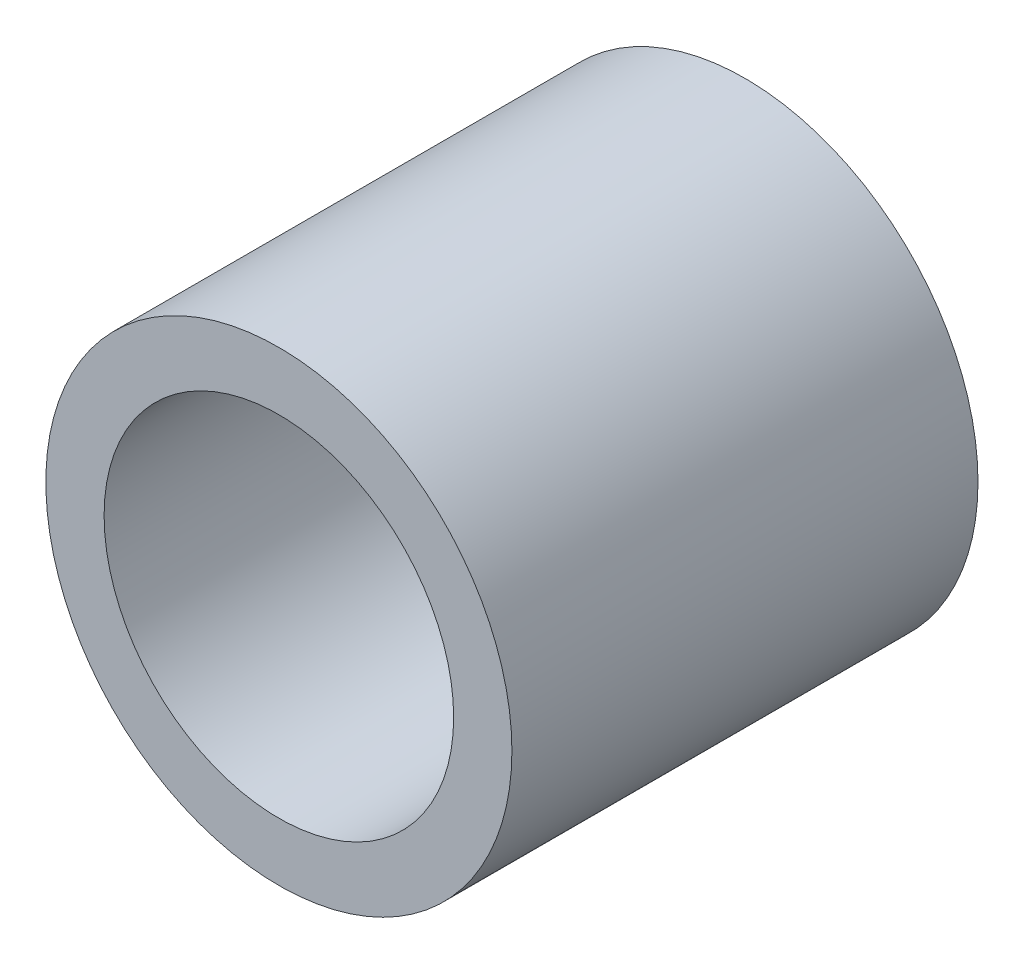
ISO-10303-21;
HEADER;
FILE_DESCRIPTION(('STEP AP214'),'2;1');
FILE_NAME('part.step','',(''),(''),'','','');
FILE_SCHEMA(('AUTOMOTIVE_DESIGN { 1 0 10303 214 1 1 1 1 }'));
ENDSEC;
DATA;
#1=APPLICATION_CONTEXT('core data for automotive mechanical design processes');
#2=APPLICATION_PROTOCOL_DEFINITION('international standard','automotive_design',2000,#1);
#3=PRODUCT_CONTEXT('',#1,'mechanical');
#4=PRODUCT('Part','Part','',(#3));
#5=PRODUCT_RELATED_PRODUCT_CATEGORY('part','',(#4));
#6=PRODUCT_DEFINITION_FORMATION('','',#4);
#7=PRODUCT_DEFINITION_CONTEXT('part definition',#1,'design');
#8=PRODUCT_DEFINITION('design','',#6,#7);
#9=PRODUCT_DEFINITION_SHAPE('','',#8);
#10=(LENGTH_UNIT() NAMED_UNIT(*) SI_UNIT(.MILLI.,.METRE.));
#11=(NAMED_UNIT(*) PLANE_ANGLE_UNIT() SI_UNIT($,.RADIAN.));
#12=(NAMED_UNIT(*) SI_UNIT($,.STERADIAN.) SOLID_ANGLE_UNIT());
#13=UNCERTAINTY_MEASURE_WITH_UNIT(LENGTH_MEASURE(1.E-05),#10,'distance_accuracy_value','');
#14=(GEOMETRIC_REPRESENTATION_CONTEXT(3) GLOBAL_UNCERTAINTY_ASSIGNED_CONTEXT((#13)) GLOBAL_UNIT_ASSIGNED_CONTEXT((#10,
#11,#12)) REPRESENTATION_CONTEXT('',''));
#15=CARTESIAN_POINT('',(0.,0.,0.));
#16=DIRECTION('',(0.,0.,1.));
#17=DIRECTION('',(1.,0.,0.));
#18=AXIS2_PLACEMENT_3D('',#15,#16,#17);
#19=CARTESIAN_POINT('',(0.,0.,8.));
#20=DIRECTION('',(0.,0.,1.));
#21=DIRECTION('',(1.,0.,0.));
#22=AXIS2_PLACEMENT_3D('',#19,#20,#21);
#23=PLANE('',#22);
#24=CARTESIAN_POINT('',(0.,0.,8.));
#25=DIRECTION('',(0.,0.,1.));
#26=DIRECTION('',(1.,0.,0.));
#27=AXIS2_PLACEMENT_3D('',#24,#25,#26);
#28=CIRCLE('',#27,4.);
#29=CARTESIAN_POINT('',(4.,0.,8.));
#30=VERTEX_POINT('',#29);
#31=EDGE_CURVE('E10',#30,#30,#28,.T.);
#32=ORIENTED_EDGE('',*,*,#31,.T.);
#33=EDGE_LOOP('',(#32));
#34=FACE_BOUND('',#33,.T.);
#35=CARTESIAN_POINT('',(0.,0.,8.));
#36=DIRECTION('',(0.,0.,1.));
#37=DIRECTION('',(1.,0.,0.));
#38=AXIS2_PLACEMENT_3D('',#35,#36,#37);
#39=CIRCLE('',#38,3.);
#40=CARTESIAN_POINT('',(3.,0.,8.));
#41=VERTEX_POINT('',#40);
#42=EDGE_CURVE('E46',#41,#41,#39,.T.);
#43=ORIENTED_EDGE('',*,*,#42,.F.);
#44=EDGE_LOOP('',(#43));
#45=FACE_BOUND('',#44,.T.);
#46=ADVANCED_FACE('F35',(#34,#45),#23,.T.);
#47=CARTESIAN_POINT('',(0.,0.,0.));
#48=DIRECTION('',(0.,0.,1.));
#49=DIRECTION('',(1.,0.,0.));
#50=AXIS2_PLACEMENT_3D('',#47,#48,#49);
#51=PLANE('',#50);
#52=CARTESIAN_POINT('',(0.,0.,0.));
#53=DIRECTION('',(0.,0.,1.));
#54=DIRECTION('',(1.,0.,0.));
#55=AXIS2_PLACEMENT_3D('',#52,#53,#54);
#56=CIRCLE('',#55,4.);
#57=CARTESIAN_POINT('',(4.,0.,0.));
#58=VERTEX_POINT('',#57);
#59=EDGE_CURVE('E39',#58,#58,#56,.T.);
#60=ORIENTED_EDGE('',*,*,#59,.F.);
#61=EDGE_LOOP('',(#60));
#62=FACE_BOUND('',#61,.T.);
#63=CARTESIAN_POINT('',(0.,0.,0.));
#64=DIRECTION('',(0.,0.,1.));
#65=DIRECTION('',(1.,0.,0.));
#66=AXIS2_PLACEMENT_3D('',#63,#64,#65);
#67=CIRCLE('',#66,3.);
#68=CARTESIAN_POINT('',(3.,0.,0.));
#69=VERTEX_POINT('',#68);
#70=EDGE_CURVE('E48',#69,#69,#67,.T.);
#71=ORIENTED_EDGE('',*,*,#70,.T.);
#72=EDGE_LOOP('',(#71));
#73=FACE_BOUND('',#72,.T.);
#74=ADVANCED_FACE('F58',(#62,#73),#51,.F.);
#75=CARTESIAN_POINT('',(0.,0.,8.));
#76=DIRECTION('',(0.,0.,-1.));
#77=DIRECTION('',(-1.,0.,0.));
#78=AXIS2_PLACEMENT_3D('',#75,#76,#77);
#79=CYLINDRICAL_SURFACE('',#78,4.);
#80=ORIENTED_EDGE('',*,*,#31,.F.);
#81=EDGE_LOOP('',(#80));
#82=FACE_BOUND('',#81,.T.);
#83=ORIENTED_EDGE('',*,*,#59,.T.);
#84=EDGE_LOOP('',(#83));
#85=FACE_BOUND('',#84,.T.);
#86=ADVANCED_FACE('F37',(#82,#85),#79,.T.);
#87=CARTESIAN_POINT('',(0.,0.,8.));
#88=DIRECTION('',(0.,0.,-1.));
#89=DIRECTION('',(-1.,0.,0.));
#90=AXIS2_PLACEMENT_3D('',#87,#88,#89);
#91=CYLINDRICAL_SURFACE('',#90,3.);
#92=ORIENTED_EDGE('',*,*,#42,.T.);
#93=EDGE_LOOP('',(#92));
#94=FACE_BOUND('',#93,.T.);
#95=ORIENTED_EDGE('',*,*,#70,.F.);
#96=EDGE_LOOP('',(#95));
#97=FACE_BOUND('',#96,.T.);
#98=ADVANCED_FACE('F54',(#94,#97),#91,.F.);
#99=CLOSED_SHELL('',(#46,#74,#86,#98));
#100=MANIFOLD_SOLID_BREP('B2',#99);
#101=ADVANCED_BREP_SHAPE_REPRESENTATION('',(#18,#100),#14);
#102=SHAPE_DEFINITION_REPRESENTATION(#9,#101);
ENDSEC;
END-ISO-10303-21;
